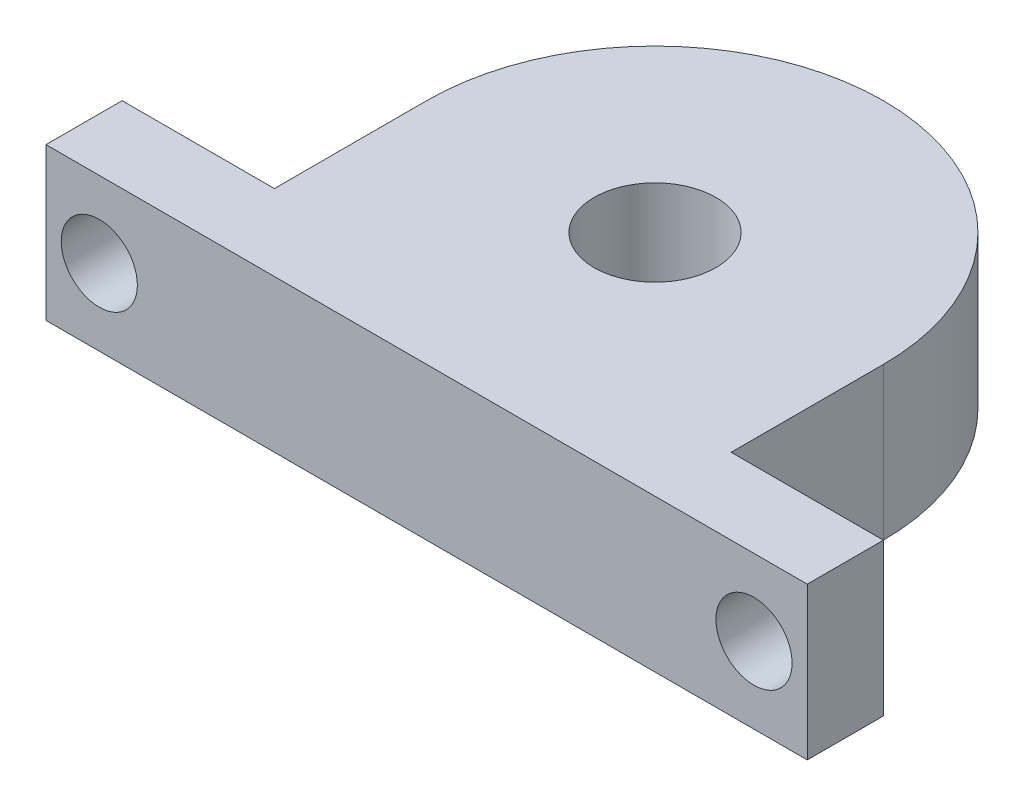
ISO-10303-21;
HEADER;
FILE_DESCRIPTION(('STEP AP214'),'2;1');
FILE_NAME('part.step','',(''),(''),'','','');
FILE_SCHEMA(('AUTOMOTIVE_DESIGN { 1 0 10303 214 1 1 1 1 }'));
ENDSEC;
DATA;
#1=APPLICATION_CONTEXT('core data for automotive mechanical design processes');
#2=APPLICATION_PROTOCOL_DEFINITION('international standard','automotive_design',2000,#1);
#3=PRODUCT_CONTEXT('',#1,'mechanical');
#4=PRODUCT('Part','Part','',(#3));
#5=PRODUCT_RELATED_PRODUCT_CATEGORY('part','',(#4));
#6=PRODUCT_DEFINITION_FORMATION('','',#4);
#7=PRODUCT_DEFINITION_CONTEXT('part definition',#1,'design');
#8=PRODUCT_DEFINITION('design','',#6,#7);
#9=PRODUCT_DEFINITION_SHAPE('','',#8);
#10=(LENGTH_UNIT() NAMED_UNIT(*) SI_UNIT(.MILLI.,.METRE.));
#11=(NAMED_UNIT(*) PLANE_ANGLE_UNIT() SI_UNIT($,.RADIAN.));
#12=(NAMED_UNIT(*) SI_UNIT($,.STERADIAN.) SOLID_ANGLE_UNIT());
#13=UNCERTAINTY_MEASURE_WITH_UNIT(LENGTH_MEASURE(1.E-05),#10,'distance_accuracy_value','');
#14=(GEOMETRIC_REPRESENTATION_CONTEXT(3) GLOBAL_UNCERTAINTY_ASSIGNED_CONTEXT((#13)) GLOBAL_UNIT_ASSIGNED_CONTEXT((#10,
#11,#12)) REPRESENTATION_CONTEXT('',''));
#15=CARTESIAN_POINT('',(0.,0.,0.));
#16=DIRECTION('',(0.,0.,1.));
#17=DIRECTION('',(1.,0.,0.));
#18=AXIS2_PLACEMENT_3D('',#15,#16,#17);
#19=CARTESIAN_POINT('',(0.,-5.,0.));
#20=DIRECTION('',(0.,1.,0.));
#21=DIRECTION('',(0.,0.,1.));
#22=AXIS2_PLACEMENT_3D('',#19,#20,#21);
#23=CYLINDRICAL_SURFACE('',#22,15.);
#24=DIRECTION('',(0.,1.,0.));
#25=VECTOR('',#24,1.);
#26=CARTESIAN_POINT('',(-15.,-5.,0.));
#27=LINE('',#26,#25);
#28=CARTESIAN_POINT('',(-15.,-5.,0.));
#29=VERTEX_POINT('',#28);
#30=CARTESIAN_POINT('',(-15.,5.,0.));
#31=VERTEX_POINT('',#30);
#32=EDGE_CURVE('E95',#29,#31,#27,.T.);
#33=ORIENTED_EDGE('',*,*,#32,.T.);
#34=CARTESIAN_POINT('',(0.,5.,0.));
#35=DIRECTION('',(0.,1.,0.));
#36=DIRECTION('',(0.,0.,-1.));
#37=AXIS2_PLACEMENT_3D('',#34,#35,#36);
#38=CIRCLE('',#37,15.);
#39=CARTESIAN_POINT('',(15.,5.,0.));
#40=VERTEX_POINT('',#39);
#41=EDGE_CURVE('E98',#40,#31,#38,.T.);
#42=ORIENTED_EDGE('',*,*,#41,.F.);
#43=DIRECTION('',(0.,1.,0.));
#44=VECTOR('',#43,1.);
#45=CARTESIAN_POINT('',(15.,-5.,0.));
#46=LINE('',#45,#44);
#47=CARTESIAN_POINT('',(15.,-5.,0.));
#48=VERTEX_POINT('',#47);
#49=EDGE_CURVE('E11',#48,#40,#46,.T.);
#50=ORIENTED_EDGE('',*,*,#49,.F.);
#51=CARTESIAN_POINT('',(0.,-5.,0.));
#52=DIRECTION('',(0.,1.,0.));
#53=DIRECTION('',(0.,0.,-1.));
#54=AXIS2_PLACEMENT_3D('',#51,#52,#53);
#55=CIRCLE('',#54,15.);
#56=EDGE_CURVE('E99',#48,#29,#55,.T.);
#57=ORIENTED_EDGE('',*,*,#56,.T.);
#58=EDGE_LOOP('',(#33,#42,#50,#57));
#59=FACE_BOUND('',#58,.T.);
#60=ADVANCED_FACE('F33',(#59),#23,.T.);
#61=CARTESIAN_POINT('',(15.,-5.,0.));
#62=DIRECTION('',(1.,0.,0.));
#63=DIRECTION('',(0.,0.,-1.));
#64=AXIS2_PLACEMENT_3D('',#61,#62,#63);
#65=PLANE('',#64);
#66=ORIENTED_EDGE('',*,*,#49,.T.);
#67=DIRECTION('',(0.,0.,-1.));
#68=VECTOR('',#67,1.);
#69=CARTESIAN_POINT('',(15.,5.,0.));
#70=LINE('',#69,#68);
#71=CARTESIAN_POINT('',(15.,5.,10.));
#72=VERTEX_POINT('',#71);
#73=EDGE_CURVE('E116',#72,#40,#70,.T.);
#74=ORIENTED_EDGE('',*,*,#73,.F.);
#75=DIRECTION('',(0.,1.,0.));
#76=VECTOR('',#75,1.);
#77=CARTESIAN_POINT('',(15.,-5.,10.));
#78=LINE('',#77,#76);
#79=CARTESIAN_POINT('',(15.,-5.,10.));
#80=VERTEX_POINT('',#79);
#81=EDGE_CURVE('E41',#80,#72,#78,.T.);
#82=ORIENTED_EDGE('',*,*,#81,.F.);
#83=DIRECTION('',(0.,0.,-1.));
#84=VECTOR('',#83,1.);
#85=CARTESIAN_POINT('',(15.,-5.,0.));
#86=LINE('',#85,#84);
#87=EDGE_CURVE('E104',#80,#48,#86,.T.);
#88=ORIENTED_EDGE('',*,*,#87,.T.);
#89=EDGE_LOOP('',(#66,#74,#82,#88));
#90=FACE_BOUND('',#89,.T.);
#91=ADVANCED_FACE('F186',(#90),#65,.T.);
#92=CARTESIAN_POINT('',(25.,-5.,10.));
#93=DIRECTION('',(0.,0.,-1.));
#94=DIRECTION('',(-1.,0.,0.));
#95=AXIS2_PLACEMENT_3D('',#92,#93,#94);
#96=PLANE('',#95);
#97=CARTESIAN_POINT('',(21.5,0.,10.));
#98=DIRECTION('',(0.,0.,-1.));
#99=DIRECTION('',(-1.,0.,0.));
#100=AXIS2_PLACEMENT_3D('',#97,#98,#99);
#101=CIRCLE('',#100,2.5);
#102=CARTESIAN_POINT('',(19.,0.,10.));
#103=VERTEX_POINT('',#102);
#104=EDGE_CURVE('E220',#103,#103,#101,.F.);
#105=ORIENTED_EDGE('',*,*,#104,.T.);
#106=EDGE_LOOP('',(#105));
#107=FACE_BOUND('',#106,.T.);
#108=ORIENTED_EDGE('',*,*,#81,.T.);
#109=DIRECTION('',(-1.,0.,0.));
#110=VECTOR('',#109,1.);
#111=CARTESIAN_POINT('',(25.,5.,10.));
#112=LINE('',#111,#110);
#113=CARTESIAN_POINT('',(25.,5.,10.));
#114=VERTEX_POINT('',#113);
#115=EDGE_CURVE('E134',#114,#72,#112,.T.);
#116=ORIENTED_EDGE('',*,*,#115,.F.);
#117=DIRECTION('',(0.,1.,0.));
#118=VECTOR('',#117,1.);
#119=CARTESIAN_POINT('',(25.,-5.,10.));
#120=LINE('',#119,#118);
#121=CARTESIAN_POINT('',(25.,-5.,10.));
#122=VERTEX_POINT('',#121);
#123=EDGE_CURVE('E156',#122,#114,#120,.T.);
#124=ORIENTED_EDGE('',*,*,#123,.F.);
#125=DIRECTION('',(-1.,0.,0.));
#126=VECTOR('',#125,1.);
#127=CARTESIAN_POINT('',(25.,-5.,10.));
#128=LINE('',#127,#126);
#129=EDGE_CURVE('E152',#122,#80,#128,.T.);
#130=ORIENTED_EDGE('',*,*,#129,.T.);
#131=EDGE_LOOP('',(#108,#116,#124,#130));
#132=FACE_BOUND('',#131,.T.);
#133=ADVANCED_FACE('F185',(#107,#132),#96,.T.);
#134=CARTESIAN_POINT('',(25.,-5.,15.));
#135=DIRECTION('',(1.,0.,0.));
#136=DIRECTION('',(0.,0.,-1.));
#137=AXIS2_PLACEMENT_3D('',#134,#135,#136);
#138=PLANE('',#137);
#139=ORIENTED_EDGE('',*,*,#123,.T.);
#140=DIRECTION('',(0.,0.,-1.));
#141=VECTOR('',#140,1.);
#142=CARTESIAN_POINT('',(25.,5.,15.));
#143=LINE('',#142,#141);
#144=CARTESIAN_POINT('',(25.,5.,15.));
#145=VERTEX_POINT('',#144);
#146=EDGE_CURVE('E131',#145,#114,#143,.T.);
#147=ORIENTED_EDGE('',*,*,#146,.F.);
#148=DIRECTION('',(0.,1.,0.));
#149=VECTOR('',#148,1.);
#150=CARTESIAN_POINT('',(25.,-5.,15.));
#151=LINE('',#150,#149);
#152=CARTESIAN_POINT('',(25.,-5.,15.));
#153=VERTEX_POINT('',#152);
#154=EDGE_CURVE('E158',#153,#145,#151,.T.);
#155=ORIENTED_EDGE('',*,*,#154,.F.);
#156=DIRECTION('',(0.,0.,-1.));
#157=VECTOR('',#156,1.);
#158=CARTESIAN_POINT('',(25.,-5.,15.));
#159=LINE('',#158,#157);
#160=EDGE_CURVE('E149',#153,#122,#159,.T.);
#161=ORIENTED_EDGE('',*,*,#160,.T.);
#162=EDGE_LOOP('',(#139,#147,#155,#161));
#163=FACE_BOUND('',#162,.T.);
#164=ADVANCED_FACE('F181',(#163),#138,.T.);
#165=CARTESIAN_POINT('',(-25.,-5.,15.));
#166=DIRECTION('',(0.,0.,1.));
#167=DIRECTION('',(1.,0.,0.));
#168=AXIS2_PLACEMENT_3D('',#165,#166,#167);
#169=PLANE('',#168);
#170=CARTESIAN_POINT('',(21.5,0.,15.));
#171=DIRECTION('',(0.,0.,1.));
#172=DIRECTION('',(1.,0.,0.));
#173=AXIS2_PLACEMENT_3D('',#170,#171,#172);
#174=CIRCLE('',#173,2.5);
#175=CARTESIAN_POINT('',(24.,0.,15.));
#176=VERTEX_POINT('',#175);
#177=EDGE_CURVE('E227',#176,#176,#174,.T.);
#178=ORIENTED_EDGE('',*,*,#177,.F.);
#179=EDGE_LOOP('',(#178));
#180=FACE_BOUND('',#179,.T.);
#181=CARTESIAN_POINT('',(-21.5,0.,15.));
#182=DIRECTION('',(0.,0.,1.));
#183=DIRECTION('',(1.,0.,0.));
#184=AXIS2_PLACEMENT_3D('',#181,#182,#183);
#185=CIRCLE('',#184,2.5);
#186=CARTESIAN_POINT('',(-19.,0.,15.));
#187=VERTEX_POINT('',#186);
#188=EDGE_CURVE('E224',#187,#187,#185,.T.);
#189=ORIENTED_EDGE('',*,*,#188,.F.);
#190=EDGE_LOOP('',(#189));
#191=FACE_BOUND('',#190,.T.);
#192=ORIENTED_EDGE('',*,*,#154,.T.);
#193=DIRECTION('',(1.,0.,0.));
#194=VECTOR('',#193,1.);
#195=CARTESIAN_POINT('',(-25.,5.,15.));
#196=LINE('',#195,#194);
#197=CARTESIAN_POINT('',(-25.,5.,15.));
#198=VERTEX_POINT('',#197);
#199=EDGE_CURVE('E128',#198,#145,#196,.T.);
#200=ORIENTED_EDGE('',*,*,#199,.F.);
#201=DIRECTION('',(0.,1.,0.));
#202=VECTOR('',#201,1.);
#203=CARTESIAN_POINT('',(-25.,-5.,15.));
#204=LINE('',#203,#202);
#205=CARTESIAN_POINT('',(-25.,-5.,15.));
#206=VERTEX_POINT('',#205);
#207=EDGE_CURVE('E160',#206,#198,#204,.T.);
#208=ORIENTED_EDGE('',*,*,#207,.F.);
#209=DIRECTION('',(1.,0.,0.));
#210=VECTOR('',#209,1.);
#211=CARTESIAN_POINT('',(-25.,-5.,15.));
#212=LINE('',#211,#210);
#213=EDGE_CURVE('E146',#206,#153,#212,.T.);
#214=ORIENTED_EDGE('',*,*,#213,.T.);
#215=EDGE_LOOP('',(#192,#200,#208,#214));
#216=FACE_BOUND('',#215,.T.);
#217=ADVANCED_FACE('F174',(#180,#191,#216),#169,.T.);
#218=CARTESIAN_POINT('',(-25.,-5.,15.));
#219=DIRECTION('',(-1.,0.,0.));
#220=DIRECTION('',(0.,0.,1.));
#221=AXIS2_PLACEMENT_3D('',#218,#219,#220);
#222=PLANE('',#221);
#223=ORIENTED_EDGE('',*,*,#207,.T.);
#224=DIRECTION('',(0.,0.,1.));
#225=VECTOR('',#224,1.);
#226=CARTESIAN_POINT('',(-25.,5.,15.));
#227=LINE('',#226,#225);
#228=CARTESIAN_POINT('',(-25.,5.,10.));
#229=VERTEX_POINT('',#228);
#230=EDGE_CURVE('E125',#229,#198,#227,.T.);
#231=ORIENTED_EDGE('',*,*,#230,.F.);
#232=DIRECTION('',(0.,1.,0.));
#233=VECTOR('',#232,1.);
#234=CARTESIAN_POINT('',(-25.,-5.,10.));
#235=LINE('',#234,#233);
#236=CARTESIAN_POINT('',(-25.,-5.,10.));
#237=VERTEX_POINT('',#236);
#238=EDGE_CURVE('E162',#237,#229,#235,.T.);
#239=ORIENTED_EDGE('',*,*,#238,.F.);
#240=DIRECTION('',(0.,0.,1.));
#241=VECTOR('',#240,1.);
#242=CARTESIAN_POINT('',(-25.,-5.,15.));
#243=LINE('',#242,#241);
#244=EDGE_CURVE('E143',#237,#206,#243,.T.);
#245=ORIENTED_EDGE('',*,*,#244,.T.);
#246=EDGE_LOOP('',(#223,#231,#239,#245));
#247=FACE_BOUND('',#246,.T.);
#248=ADVANCED_FACE('F171',(#247),#222,.T.);
#249=CARTESIAN_POINT('',(-15.,-5.,10.));
#250=DIRECTION('',(0.,0.,-1.));
#251=DIRECTION('',(-1.,0.,0.));
#252=AXIS2_PLACEMENT_3D('',#249,#250,#251);
#253=PLANE('',#252);
#254=CARTESIAN_POINT('',(-21.5,0.,10.));
#255=DIRECTION('',(0.,0.,-1.));
#256=DIRECTION('',(-1.,0.,0.));
#257=AXIS2_PLACEMENT_3D('',#254,#255,#256);
#258=CIRCLE('',#257,2.5);
#259=CARTESIAN_POINT('',(-24.,0.,10.));
#260=VERTEX_POINT('',#259);
#261=EDGE_CURVE('E36',#260,#260,#258,.F.);
#262=ORIENTED_EDGE('',*,*,#261,.T.);
#263=EDGE_LOOP('',(#262));
#264=FACE_BOUND('',#263,.T.);
#265=ORIENTED_EDGE('',*,*,#238,.T.);
#266=DIRECTION('',(-1.,0.,0.));
#267=VECTOR('',#266,1.);
#268=CARTESIAN_POINT('',(-15.,5.,10.));
#269=LINE('',#268,#267);
#270=CARTESIAN_POINT('',(-15.,5.,10.));
#271=VERTEX_POINT('',#270);
#272=EDGE_CURVE('E111',#271,#229,#269,.T.);
#273=ORIENTED_EDGE('',*,*,#272,.F.);
#274=DIRECTION('',(0.,1.,0.));
#275=VECTOR('',#274,1.);
#276=CARTESIAN_POINT('',(-15.,-5.,10.));
#277=LINE('',#276,#275);
#278=CARTESIAN_POINT('',(-15.,-5.,10.));
#279=VERTEX_POINT('',#278);
#280=EDGE_CURVE('E103',#279,#271,#277,.T.);
#281=ORIENTED_EDGE('',*,*,#280,.F.);
#282=DIRECTION('',(-1.,0.,0.));
#283=VECTOR('',#282,1.);
#284=CARTESIAN_POINT('',(-15.,-5.,10.));
#285=LINE('',#284,#283);
#286=EDGE_CURVE('E140',#279,#237,#285,.T.);
#287=ORIENTED_EDGE('',*,*,#286,.T.);
#288=EDGE_LOOP('',(#265,#273,#281,#287));
#289=FACE_BOUND('',#288,.T.);
#290=ADVANCED_FACE('F165',(#264,#289),#253,.T.);
#291=CARTESIAN_POINT('',(-15.,-5.,0.));
#292=DIRECTION('',(-1.,0.,0.));
#293=DIRECTION('',(0.,0.,1.));
#294=AXIS2_PLACEMENT_3D('',#291,#292,#293);
#295=PLANE('',#294);
#296=ORIENTED_EDGE('',*,*,#280,.T.);
#297=DIRECTION('',(0.,0.,1.));
#298=VECTOR('',#297,1.);
#299=CARTESIAN_POINT('',(-15.,5.,0.));
#300=LINE('',#299,#298);
#301=EDGE_CURVE('E106',#31,#271,#300,.T.);
#302=ORIENTED_EDGE('',*,*,#301,.F.);
#303=ORIENTED_EDGE('',*,*,#32,.F.);
#304=DIRECTION('',(0.,0.,1.));
#305=VECTOR('',#304,1.);
#306=CARTESIAN_POINT('',(-15.,-5.,0.));
#307=LINE('',#306,#305);
#308=EDGE_CURVE('E138',#29,#279,#307,.T.);
#309=ORIENTED_EDGE('',*,*,#308,.T.);
#310=EDGE_LOOP('',(#296,#302,#303,#309));
#311=FACE_BOUND('',#310,.T.);
#312=ADVANCED_FACE('F107',(#311),#295,.T.);
#313=CARTESIAN_POINT('',(0.,-5.,0.));
#314=DIRECTION('',(0.,-1.,0.));
#315=DIRECTION('',(0.,0.,-1.));
#316=AXIS2_PLACEMENT_3D('',#313,#314,#315);
#317=PLANE('',#316);
#318=CARTESIAN_POINT('',(0.,-5.,0.));
#319=DIRECTION('',(0.,1.,0.));
#320=DIRECTION('',(0.,0.,1.));
#321=AXIS2_PLACEMENT_3D('',#318,#319,#320);
#322=CIRCLE('',#321,4.);
#323=CARTESIAN_POINT('',(0.,-5.,4.));
#324=VERTEX_POINT('',#323);
#325=EDGE_CURVE('E120',#324,#324,#322,.T.);
#326=ORIENTED_EDGE('',*,*,#325,.T.);
#327=EDGE_LOOP('',(#326));
#328=FACE_BOUND('',#327,.T.);
#329=ORIENTED_EDGE('',*,*,#56,.F.);
#330=ORIENTED_EDGE('',*,*,#87,.F.);
#331=ORIENTED_EDGE('',*,*,#129,.F.);
#332=ORIENTED_EDGE('',*,*,#160,.F.);
#333=ORIENTED_EDGE('',*,*,#213,.F.);
#334=ORIENTED_EDGE('',*,*,#244,.F.);
#335=ORIENTED_EDGE('',*,*,#286,.F.);
#336=ORIENTED_EDGE('',*,*,#308,.F.);
#337=EDGE_LOOP('',(#329,#330,#331,#332,#333,#334,#335,#336));
#338=FACE_BOUND('',#337,.T.);
#339=ADVANCED_FACE('F177',(#328,#338),#317,.T.);
#340=CARTESIAN_POINT('',(0.,5.,0.));
#341=DIRECTION('',(0.,-1.,0.));
#342=DIRECTION('',(0.,0.,-1.));
#343=AXIS2_PLACEMENT_3D('',#340,#341,#342);
#344=PLANE('',#343);
#345=CARTESIAN_POINT('',(0.,5.,0.));
#346=DIRECTION('',(0.,1.,0.));
#347=DIRECTION('',(0.,0.,1.));
#348=AXIS2_PLACEMENT_3D('',#345,#346,#347);
#349=CIRCLE('',#348,4.);
#350=CARTESIAN_POINT('',(0.,5.,4.));
#351=VERTEX_POINT('',#350);
#352=EDGE_CURVE('E117',#351,#351,#349,.T.);
#353=ORIENTED_EDGE('',*,*,#352,.F.);
#354=EDGE_LOOP('',(#353));
#355=FACE_BOUND('',#354,.T.);
#356=ORIENTED_EDGE('',*,*,#41,.T.);
#357=ORIENTED_EDGE('',*,*,#301,.T.);
#358=ORIENTED_EDGE('',*,*,#272,.T.);
#359=ORIENTED_EDGE('',*,*,#230,.T.);
#360=ORIENTED_EDGE('',*,*,#199,.T.);
#361=ORIENTED_EDGE('',*,*,#146,.T.);
#362=ORIENTED_EDGE('',*,*,#115,.T.);
#363=ORIENTED_EDGE('',*,*,#73,.T.);
#364=EDGE_LOOP('',(#356,#357,#358,#359,#360,#361,#362,#363));
#365=FACE_BOUND('',#364,.T.);
#366=ADVANCED_FACE('F114',(#355,#365),#344,.F.);
#367=CARTESIAN_POINT('',(0.,5.,0.));
#368=DIRECTION('',(0.,-1.,0.));
#369=DIRECTION('',(0.,0.,-1.));
#370=AXIS2_PLACEMENT_3D('',#367,#368,#369);
#371=CYLINDRICAL_SURFACE('',#370,4.);
#372=ORIENTED_EDGE('',*,*,#352,.T.);
#373=EDGE_LOOP('',(#372));
#374=FACE_BOUND('',#373,.T.);
#375=ORIENTED_EDGE('',*,*,#325,.F.);
#376=EDGE_LOOP('',(#375));
#377=FACE_BOUND('',#376,.T.);
#378=ADVANCED_FACE('F215',(#374,#377),#371,.F.);
#379=CARTESIAN_POINT('',(-21.5,0.,15.));
#380=DIRECTION('',(0.,0.,-1.));
#381=DIRECTION('',(-1.,0.,0.));
#382=AXIS2_PLACEMENT_3D('',#379,#380,#381);
#383=CYLINDRICAL_SURFACE('',#382,2.5);
#384=ORIENTED_EDGE('',*,*,#261,.F.);
#385=EDGE_LOOP('',(#384));
#386=FACE_BOUND('',#385,.T.);
#387=ORIENTED_EDGE('',*,*,#188,.T.);
#388=EDGE_LOOP('',(#387));
#389=FACE_BOUND('',#388,.T.);
#390=ADVANCED_FACE('F234',(#386,#389),#383,.F.);
#391=CARTESIAN_POINT('',(21.5,0.,15.));
#392=DIRECTION('',(0.,0.,-1.));
#393=DIRECTION('',(-1.,0.,0.));
#394=AXIS2_PLACEMENT_3D('',#391,#392,#393);
#395=CYLINDRICAL_SURFACE('',#394,2.5);
#396=ORIENTED_EDGE('',*,*,#104,.F.);
#397=EDGE_LOOP('',(#396));
#398=FACE_BOUND('',#397,.T.);
#399=ORIENTED_EDGE('',*,*,#177,.T.);
#400=EDGE_LOOP('',(#399));
#401=FACE_BOUND('',#400,.T.);
#402=ADVANCED_FACE('F237',(#398,#401),#395,.F.);
#403=CLOSED_SHELL('',(#60,#91,#133,#164,#217,#248,#290,#312,#339,#366,#378,#390,#402));
#404=MANIFOLD_SOLID_BREP('B2',#403);
#405=ADVANCED_BREP_SHAPE_REPRESENTATION('',(#18,#404),#14);
#406=SHAPE_DEFINITION_REPRESENTATION(#9,#405);
ENDSEC;
END-ISO-10303-21;
